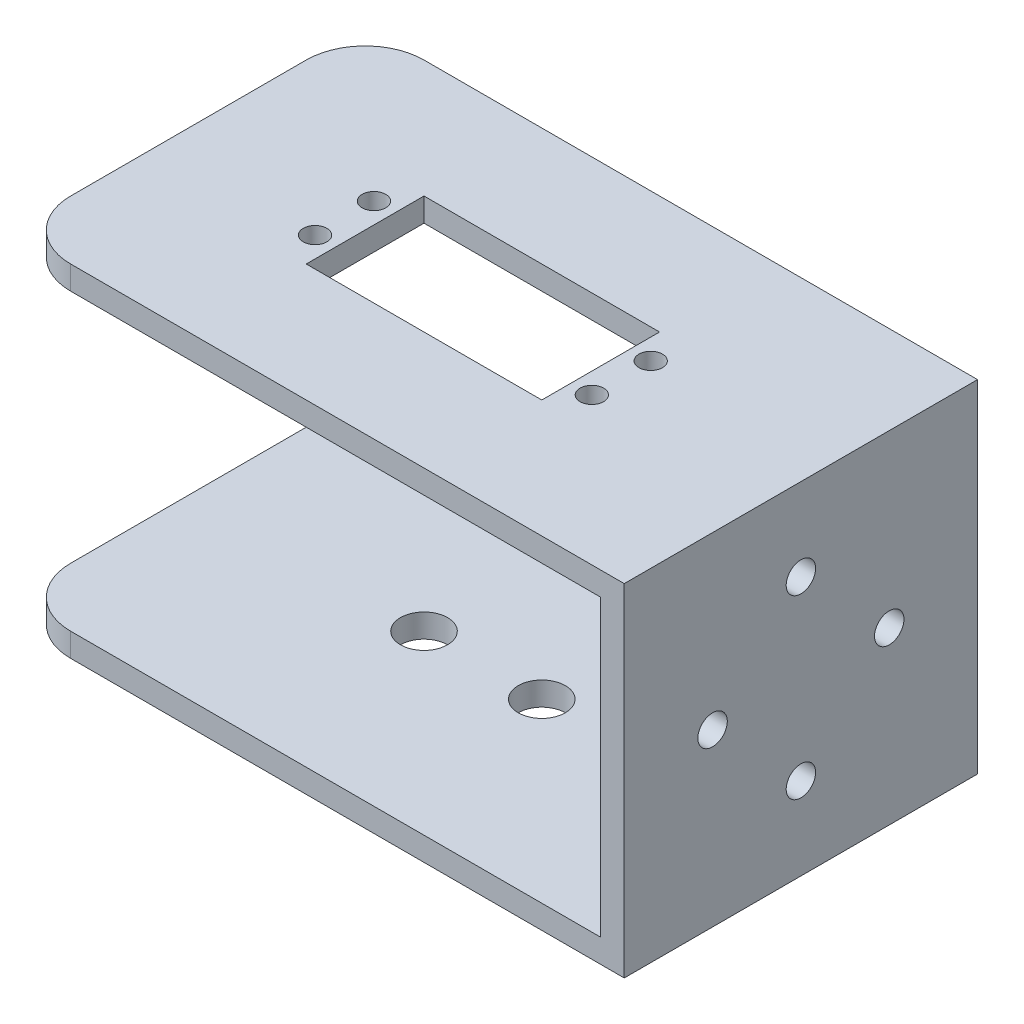
ISO-10303-21;
HEADER;
FILE_DESCRIPTION(('STEP AP214'),'2;1');
FILE_NAME('part.step','',(''),(''),'','','');
FILE_SCHEMA(('AUTOMOTIVE_DESIGN { 1 0 10303 214 1 1 1 1 }'));
ENDSEC;
DATA;
#1=APPLICATION_CONTEXT('core data for automotive mechanical design processes');
#2=APPLICATION_PROTOCOL_DEFINITION('international standard','automotive_design',2000,#1);
#3=PRODUCT_CONTEXT('',#1,'mechanical');
#4=PRODUCT('Part','Part','',(#3));
#5=PRODUCT_RELATED_PRODUCT_CATEGORY('part','',(#4));
#6=PRODUCT_DEFINITION_FORMATION('','',#4);
#7=PRODUCT_DEFINITION_CONTEXT('part definition',#1,'design');
#8=PRODUCT_DEFINITION('design','',#6,#7);
#9=PRODUCT_DEFINITION_SHAPE('','',#8);
#10=(LENGTH_UNIT() NAMED_UNIT(*) SI_UNIT(.MILLI.,.METRE.));
#11=(NAMED_UNIT(*) PLANE_ANGLE_UNIT() SI_UNIT($,.RADIAN.));
#12=(NAMED_UNIT(*) SI_UNIT($,.STERADIAN.) SOLID_ANGLE_UNIT());
#13=UNCERTAINTY_MEASURE_WITH_UNIT(LENGTH_MEASURE(1.E-05),#10,'distance_accuracy_value','');
#14=(GEOMETRIC_REPRESENTATION_CONTEXT(3) GLOBAL_UNCERTAINTY_ASSIGNED_CONTEXT((#13)) GLOBAL_UNIT_ASSIGNED_CONTEXT((#10,
#11,#12)) REPRESENTATION_CONTEXT('',''));
#15=CARTESIAN_POINT('',(0.,0.,0.));
#16=DIRECTION('',(0.,0.,1.));
#17=DIRECTION('',(1.,0.,0.));
#18=AXIS2_PLACEMENT_3D('',#15,#16,#17);
#19=CARTESIAN_POINT('',(100.,54.,60.));
#20=DIRECTION('',(0.,-1.,0.));
#21=DIRECTION('',(1.,0.,0.));
#22=AXIS2_PLACEMENT_3D('',#19,#20,#21);
#23=PLANE('',#22);
#24=CARTESIAN_POINT('',(26.5,54.,25.));
#25=DIRECTION('',(0.,1.,0.));
#26=DIRECTION('',(-1.,0.,0.));
#27=AXIS2_PLACEMENT_3D('',#24,#25,#26);
#28=CIRCLE('',#27,2.);
#29=CARTESIAN_POINT('',(24.5,54.,25.));
#30=VERTEX_POINT('',#29);
#31=EDGE_CURVE('E178',#30,#30,#28,.T.);
#32=ORIENTED_EDGE('',*,*,#31,.F.);
#33=EDGE_LOOP('',(#32));
#34=FACE_BOUND('',#33,.T.);
#35=CARTESIAN_POINT('',(26.5,54.,35.));
#36=DIRECTION('',(0.,1.,0.));
#37=DIRECTION('',(1.,0.,0.));
#38=AXIS2_PLACEMENT_3D('',#35,#36,#37);
#39=CIRCLE('',#38,1.99999999999999);
#40=CARTESIAN_POINT('',(28.5,54.,35.));
#41=VERTEX_POINT('',#40);
#42=EDGE_CURVE('E428',#41,#41,#39,.T.);
#43=ORIENTED_EDGE('',*,*,#42,.F.);
#44=EDGE_LOOP('',(#43));
#45=FACE_BOUND('',#44,.T.);
#46=CARTESIAN_POINT('',(73.5,54.,35.));
#47=DIRECTION('',(0.,1.,0.));
#48=DIRECTION('',(-1.,0.,0.));
#49=AXIS2_PLACEMENT_3D('',#46,#47,#48);
#50=CIRCLE('',#49,1.99999999999999);
#51=CARTESIAN_POINT('',(71.5,54.,35.));
#52=VERTEX_POINT('',#51);
#53=EDGE_CURVE('E434',#52,#52,#50,.T.);
#54=ORIENTED_EDGE('',*,*,#53,.F.);
#55=EDGE_LOOP('',(#54));
#56=FACE_BOUND('',#55,.T.);
#57=CARTESIAN_POINT('',(73.5,54.,25.));
#58=DIRECTION('',(0.,1.,0.));
#59=DIRECTION('',(1.,0.,0.));
#60=AXIS2_PLACEMENT_3D('',#57,#58,#59);
#61=CIRCLE('',#60,2.);
#62=CARTESIAN_POINT('',(75.5,54.,25.));
#63=VERTEX_POINT('',#62);
#64=EDGE_CURVE('E417',#63,#63,#61,.T.);
#65=ORIENTED_EDGE('',*,*,#64,.F.);
#66=EDGE_LOOP('',(#65));
#67=FACE_BOUND('',#66,.T.);
#68=DIRECTION('',(1.,0.,0.));
#69=VECTOR('',#68,1.);
#70=CARTESIAN_POINT('',(30.,54.,40.));
#71=LINE('',#70,#69);
#72=CARTESIAN_POINT('',(30.,54.,40.));
#73=VERTEX_POINT('',#72);
#74=CARTESIAN_POINT('',(70.,54.,40.));
#75=VERTEX_POINT('',#74);
#76=EDGE_CURVE('E169',#73,#75,#71,.T.);
#77=ORIENTED_EDGE('',*,*,#76,.F.);
#78=DIRECTION('',(0.,0.,1.));
#79=VECTOR('',#78,1.);
#80=CARTESIAN_POINT('',(30.,54.,20.));
#81=LINE('',#80,#79);
#82=CARTESIAN_POINT('',(30.,54.,20.));
#83=VERTEX_POINT('',#82);
#84=EDGE_CURVE('E50',#83,#73,#81,.T.);
#85=ORIENTED_EDGE('',*,*,#84,.F.);
#86=DIRECTION('',(-1.,0.,0.));
#87=VECTOR('',#86,1.);
#88=CARTESIAN_POINT('',(30.,54.,20.));
#89=LINE('',#88,#87);
#90=CARTESIAN_POINT('',(70.,54.,20.));
#91=VERTEX_POINT('',#90);
#92=EDGE_CURVE('E157',#91,#83,#89,.T.);
#93=ORIENTED_EDGE('',*,*,#92,.F.);
#94=DIRECTION('',(0.,0.,-1.));
#95=VECTOR('',#94,1.);
#96=CARTESIAN_POINT('',(70.,54.,20.));
#97=LINE('',#96,#95);
#98=EDGE_CURVE('E165',#75,#91,#97,.T.);
#99=ORIENTED_EDGE('',*,*,#98,.F.);
#100=EDGE_LOOP('',(#77,#85,#93,#99));
#101=FACE_BOUND('',#100,.T.);
#102=DIRECTION('',(-1.,0.,0.));
#103=VECTOR('',#102,1.);
#104=CARTESIAN_POINT('',(100.,54.,0.));
#105=LINE('',#104,#103);
#106=CARTESIAN_POINT('',(104.,54.,0.));
#107=VERTEX_POINT('',#106);
#108=CARTESIAN_POINT('',(9.99999999999999,54.,0.));
#109=VERTEX_POINT('',#108);
#110=EDGE_CURVE('E205',#107,#109,#105,.T.);
#111=ORIENTED_EDGE('',*,*,#110,.T.);
#112=CARTESIAN_POINT('',(10.,54.,10.));
#113=DIRECTION('',(0.,-1.,0.));
#114=DIRECTION('',(1.,0.,0.));
#115=AXIS2_PLACEMENT_3D('',#112,#113,#114);
#116=CIRCLE('',#115,10.);
#117=CARTESIAN_POINT('',(0.,54.,10.));
#118=VERTEX_POINT('',#117);
#119=EDGE_CURVE('E285',#109,#118,#116,.F.);
#120=ORIENTED_EDGE('',*,*,#119,.T.);
#121=DIRECTION('',(0.,0.,-1.));
#122=VECTOR('',#121,1.);
#123=CARTESIAN_POINT('',(0.,54.,60.));
#124=LINE('',#123,#122);
#125=CARTESIAN_POINT('',(0.,54.,50.));
#126=VERTEX_POINT('',#125);
#127=EDGE_CURVE('E257',#126,#118,#124,.T.);
#128=ORIENTED_EDGE('',*,*,#127,.F.);
#129=CARTESIAN_POINT('',(10.,54.,50.));
#130=DIRECTION('',(0.,-1.,0.));
#131=DIRECTION('',(1.,0.,0.));
#132=AXIS2_PLACEMENT_3D('',#129,#130,#131);
#133=CIRCLE('',#132,10.);
#134=CARTESIAN_POINT('',(9.99999999999999,54.,60.));
#135=VERTEX_POINT('',#134);
#136=EDGE_CURVE('E283',#126,#135,#133,.F.);
#137=ORIENTED_EDGE('',*,*,#136,.T.);
#138=DIRECTION('',(-1.,0.,0.));
#139=VECTOR('',#138,1.);
#140=CARTESIAN_POINT('',(100.,54.,60.));
#141=LINE('',#140,#139);
#142=CARTESIAN_POINT('',(104.,54.,60.));
#143=VERTEX_POINT('',#142);
#144=EDGE_CURVE('E208',#143,#135,#141,.T.);
#145=ORIENTED_EDGE('',*,*,#144,.F.);
#146=DIRECTION('',(0.,0.,-1.));
#147=VECTOR('',#146,1.);
#148=CARTESIAN_POINT('',(104.,54.,60.));
#149=LINE('',#148,#147);
#150=EDGE_CURVE('E224',#143,#107,#149,.T.);
#151=ORIENTED_EDGE('',*,*,#150,.T.);
#152=EDGE_LOOP('',(#111,#120,#128,#137,#145,#151));
#153=FACE_BOUND('',#152,.T.);
#154=ADVANCED_FACE('F35',(#34,#45,#56,#67,#101,#153),#23,.F.);
#155=CARTESIAN_POINT('',(0.,50.,60.));
#156=DIRECTION('',(-1.,0.,0.));
#157=DIRECTION('',(0.,0.,1.));
#158=AXIS2_PLACEMENT_3D('',#155,#156,#157);
#159=PLANE('',#158);
#160=ORIENTED_EDGE('',*,*,#127,.T.);
#161=DIRECTION('',(0.,1.,0.));
#162=VECTOR('',#161,1.);
#163=CARTESIAN_POINT('',(0.,50.,10.));
#164=LINE('',#163,#162);
#165=CARTESIAN_POINT('',(0.,50.,10.));
#166=VERTEX_POINT('',#165);
#167=EDGE_CURVE('E290',#118,#166,#164,.F.);
#168=ORIENTED_EDGE('',*,*,#167,.T.);
#169=DIRECTION('',(0.,0.,-1.));
#170=VECTOR('',#169,1.);
#171=CARTESIAN_POINT('',(0.,50.,60.));
#172=LINE('',#171,#170);
#173=CARTESIAN_POINT('',(0.,50.,50.));
#174=VERTEX_POINT('',#173);
#175=EDGE_CURVE('E254',#174,#166,#172,.T.);
#176=ORIENTED_EDGE('',*,*,#175,.F.);
#177=DIRECTION('',(0.,1.,0.));
#178=VECTOR('',#177,1.);
#179=CARTESIAN_POINT('',(0.,54.,50.));
#180=LINE('',#179,#178);
#181=EDGE_CURVE('E287',#174,#126,#180,.T.);
#182=ORIENTED_EDGE('',*,*,#181,.T.);
#183=EDGE_LOOP('',(#160,#168,#176,#182));
#184=FACE_BOUND('',#183,.T.);
#185=ADVANCED_FACE('F301',(#184),#159,.T.);
#186=CARTESIAN_POINT('',(100.,50.,60.));
#187=DIRECTION('',(0.,-1.,0.));
#188=DIRECTION('',(1.,0.,0.));
#189=AXIS2_PLACEMENT_3D('',#186,#187,#188);
#190=PLANE('',#189);
#191=CARTESIAN_POINT('',(26.5,50.,25.));
#192=DIRECTION('',(0.,-1.,0.));
#193=DIRECTION('',(1.,0.,0.));
#194=AXIS2_PLACEMENT_3D('',#191,#192,#193);
#195=CIRCLE('',#194,2.);
#196=CARTESIAN_POINT('',(28.5,50.,25.));
#197=VERTEX_POINT('',#196);
#198=EDGE_CURVE('E425',#197,#197,#195,.F.);
#199=ORIENTED_EDGE('',*,*,#198,.T.);
#200=EDGE_LOOP('',(#199));
#201=FACE_BOUND('',#200,.T.);
#202=CARTESIAN_POINT('',(26.5,50.,35.));
#203=DIRECTION('',(0.,-1.,0.));
#204=DIRECTION('',(1.,0.,0.));
#205=AXIS2_PLACEMENT_3D('',#202,#203,#204);
#206=CIRCLE('',#205,1.99999999999999);
#207=CARTESIAN_POINT('',(28.5,50.,35.));
#208=VERTEX_POINT('',#207);
#209=EDGE_CURVE('E431',#208,#208,#206,.F.);
#210=ORIENTED_EDGE('',*,*,#209,.T.);
#211=EDGE_LOOP('',(#210));
#212=FACE_BOUND('',#211,.T.);
#213=CARTESIAN_POINT('',(73.5,50.,35.));
#214=DIRECTION('',(0.,-1.,0.));
#215=DIRECTION('',(1.,0.,0.));
#216=AXIS2_PLACEMENT_3D('',#213,#214,#215);
#217=CIRCLE('',#216,1.99999999999999);
#218=CARTESIAN_POINT('',(75.5,50.,35.));
#219=VERTEX_POINT('',#218);
#220=EDGE_CURVE('E437',#219,#219,#217,.F.);
#221=ORIENTED_EDGE('',*,*,#220,.T.);
#222=EDGE_LOOP('',(#221));
#223=FACE_BOUND('',#222,.T.);
#224=CARTESIAN_POINT('',(73.5,50.,25.));
#225=DIRECTION('',(0.,-1.,0.));
#226=DIRECTION('',(1.,0.,0.));
#227=AXIS2_PLACEMENT_3D('',#224,#225,#226);
#228=CIRCLE('',#227,2.);
#229=CARTESIAN_POINT('',(75.5,50.,25.));
#230=VERTEX_POINT('',#229);
#231=EDGE_CURVE('E413',#230,#230,#228,.F.);
#232=ORIENTED_EDGE('',*,*,#231,.T.);
#233=EDGE_LOOP('',(#232));
#234=FACE_BOUND('',#233,.T.);
#235=DIRECTION('',(0.,0.,1.));
#236=VECTOR('',#235,1.);
#237=CARTESIAN_POINT('',(30.,50.,20.));
#238=LINE('',#237,#236);
#239=CARTESIAN_POINT('',(30.,50.,20.));
#240=VERTEX_POINT('',#239);
#241=CARTESIAN_POINT('',(30.,50.,40.));
#242=VERTEX_POINT('',#241);
#243=EDGE_CURVE('E150',#240,#242,#238,.T.);
#244=ORIENTED_EDGE('',*,*,#243,.T.);
#245=DIRECTION('',(1.,0.,0.));
#246=VECTOR('',#245,1.);
#247=CARTESIAN_POINT('',(30.,50.,40.));
#248=LINE('',#247,#246);
#249=CARTESIAN_POINT('',(70.,50.,40.));
#250=VERTEX_POINT('',#249);
#251=EDGE_CURVE('E172',#242,#250,#248,.T.);
#252=ORIENTED_EDGE('',*,*,#251,.T.);
#253=DIRECTION('',(0.,0.,-1.));
#254=VECTOR('',#253,1.);
#255=CARTESIAN_POINT('',(70.,50.,20.));
#256=LINE('',#255,#254);
#257=CARTESIAN_POINT('',(70.,50.,20.));
#258=VERTEX_POINT('',#257);
#259=EDGE_CURVE('E153',#250,#258,#256,.T.);
#260=ORIENTED_EDGE('',*,*,#259,.T.);
#261=DIRECTION('',(-1.,0.,0.));
#262=VECTOR('',#261,1.);
#263=CARTESIAN_POINT('',(30.,50.,20.));
#264=LINE('',#263,#262);
#265=EDGE_CURVE('E154',#258,#240,#264,.T.);
#266=ORIENTED_EDGE('',*,*,#265,.T.);
#267=EDGE_LOOP('',(#244,#252,#260,#266));
#268=FACE_BOUND('',#267,.T.);
#269=ORIENTED_EDGE('',*,*,#175,.T.);
#270=CARTESIAN_POINT('',(10.,50.,10.));
#271=DIRECTION('',(0.,-1.,0.));
#272=DIRECTION('',(1.,0.,0.));
#273=AXIS2_PLACEMENT_3D('',#270,#271,#272);
#274=CIRCLE('',#273,10.);
#275=CARTESIAN_POINT('',(9.99999999999999,50.,0.));
#276=VERTEX_POINT('',#275);
#277=EDGE_CURVE('E11',#166,#276,#274,.T.);
#278=ORIENTED_EDGE('',*,*,#277,.T.);
#279=DIRECTION('',(-1.,0.,0.));
#280=VECTOR('',#279,1.);
#281=CARTESIAN_POINT('',(100.,50.,0.));
#282=LINE('',#281,#280);
#283=CARTESIAN_POINT('',(100.,50.,0.));
#284=VERTEX_POINT('',#283);
#285=EDGE_CURVE('E227',#284,#276,#282,.T.);
#286=ORIENTED_EDGE('',*,*,#285,.F.);
#287=DIRECTION('',(0.,0.,-1.));
#288=VECTOR('',#287,1.);
#289=CARTESIAN_POINT('',(100.,50.,60.));
#290=LINE('',#289,#288);
#291=CARTESIAN_POINT('',(100.,50.,60.));
#292=VERTEX_POINT('',#291);
#293=EDGE_CURVE('E252',#292,#284,#290,.T.);
#294=ORIENTED_EDGE('',*,*,#293,.F.);
#295=DIRECTION('',(-1.,0.,0.));
#296=VECTOR('',#295,1.);
#297=CARTESIAN_POINT('',(100.,50.,60.));
#298=LINE('',#297,#296);
#299=CARTESIAN_POINT('',(9.99999999999999,50.,60.));
#300=VERTEX_POINT('',#299);
#301=EDGE_CURVE('E211',#292,#300,#298,.T.);
#302=ORIENTED_EDGE('',*,*,#301,.T.);
#303=CARTESIAN_POINT('',(10.,50.,50.));
#304=DIRECTION('',(0.,-1.,0.));
#305=DIRECTION('',(1.,0.,0.));
#306=AXIS2_PLACEMENT_3D('',#303,#304,#305);
#307=CIRCLE('',#306,10.);
#308=EDGE_CURVE('E43',#300,#174,#307,.T.);
#309=ORIENTED_EDGE('',*,*,#308,.T.);
#310=EDGE_LOOP('',(#269,#278,#286,#294,#302,#309));
#311=FACE_BOUND('',#310,.T.);
#312=ADVANCED_FACE('F294',(#201,#212,#223,#234,#268,#311),#190,.T.);
#313=CARTESIAN_POINT('',(100.,0.,60.));
#314=DIRECTION('',(-1.,0.,0.));
#315=DIRECTION('',(0.,0.,1.));
#316=AXIS2_PLACEMENT_3D('',#313,#314,#315);
#317=PLANE('',#316);
#318=CARTESIAN_POINT('',(100.,10.,30.));
#319=DIRECTION('',(-1.,0.,0.));
#320=DIRECTION('',(0.,0.,1.));
#321=AXIS2_PLACEMENT_3D('',#318,#319,#320);
#322=CIRCLE('',#321,2.5);
#323=CARTESIAN_POINT('',(100.,10.,32.5));
#324=VERTEX_POINT('',#323);
#325=EDGE_CURVE('E188',#324,#324,#322,.F.);
#326=ORIENTED_EDGE('',*,*,#325,.T.);
#327=EDGE_LOOP('',(#326));
#328=FACE_BOUND('',#327,.T.);
#329=CARTESIAN_POINT('',(100.,25.,15.));
#330=DIRECTION('',(-1.,0.,0.));
#331=DIRECTION('',(0.,0.,1.));
#332=AXIS2_PLACEMENT_3D('',#329,#330,#331);
#333=CIRCLE('',#332,2.5);
#334=CARTESIAN_POINT('',(100.,25.,17.5));
#335=VERTEX_POINT('',#334);
#336=EDGE_CURVE('E194',#335,#335,#333,.F.);
#337=ORIENTED_EDGE('',*,*,#336,.T.);
#338=EDGE_LOOP('',(#337));
#339=FACE_BOUND('',#338,.T.);
#340=CARTESIAN_POINT('',(100.,25.,45.));
#341=DIRECTION('',(-1.,0.,0.));
#342=DIRECTION('',(0.,0.,1.));
#343=AXIS2_PLACEMENT_3D('',#340,#341,#342);
#344=CIRCLE('',#343,2.5);
#345=CARTESIAN_POINT('',(100.,25.,47.5));
#346=VERTEX_POINT('',#345);
#347=EDGE_CURVE('E164',#346,#346,#344,.F.);
#348=ORIENTED_EDGE('',*,*,#347,.T.);
#349=EDGE_LOOP('',(#348));
#350=FACE_BOUND('',#349,.T.);
#351=CARTESIAN_POINT('',(100.,40.,30.));
#352=DIRECTION('',(-1.,0.,0.));
#353=DIRECTION('',(0.,0.,1.));
#354=AXIS2_PLACEMENT_3D('',#351,#352,#353);
#355=CIRCLE('',#354,2.5);
#356=CARTESIAN_POINT('',(100.,40.,32.5));
#357=VERTEX_POINT('',#356);
#358=EDGE_CURVE('E187',#357,#357,#355,.F.);
#359=ORIENTED_EDGE('',*,*,#358,.T.);
#360=EDGE_LOOP('',(#359));
#361=FACE_BOUND('',#360,.T.);
#362=DIRECTION('',(0.,1.,0.));
#363=VECTOR('',#362,1.);
#364=CARTESIAN_POINT('',(100.,0.,0.));
#365=LINE('',#364,#363);
#366=CARTESIAN_POINT('',(100.,0.,0.));
#367=VERTEX_POINT('',#366);
#368=EDGE_CURVE('E230',#367,#284,#365,.T.);
#369=ORIENTED_EDGE('',*,*,#368,.F.);
#370=DIRECTION('',(0.,0.,-1.));
#371=VECTOR('',#370,1.);
#372=CARTESIAN_POINT('',(100.,0.,60.));
#373=LINE('',#372,#371);
#374=CARTESIAN_POINT('',(100.,0.,60.));
#375=VERTEX_POINT('',#374);
#376=EDGE_CURVE('E249',#375,#367,#373,.T.);
#377=ORIENTED_EDGE('',*,*,#376,.F.);
#378=DIRECTION('',(0.,1.,0.));
#379=VECTOR('',#378,1.);
#380=CARTESIAN_POINT('',(100.,0.,60.));
#381=LINE('',#380,#379);
#382=EDGE_CURVE('E215',#375,#292,#381,.T.);
#383=ORIENTED_EDGE('',*,*,#382,.T.);
#384=ORIENTED_EDGE('',*,*,#293,.T.);
#385=EDGE_LOOP('',(#369,#377,#383,#384));
#386=FACE_BOUND('',#385,.T.);
#387=ADVANCED_FACE('F327',(#328,#339,#350,#361,#386),#317,.T.);
#388=CARTESIAN_POINT('',(0.,0.,60.));
#389=DIRECTION('',(0.,1.,0.));
#390=DIRECTION('',(0.,0.,1.));
#391=AXIS2_PLACEMENT_3D('',#388,#389,#390);
#392=PLANE('',#391);
#393=CARTESIAN_POINT('',(60.,0.,30.));
#394=DIRECTION('',(0.,1.,0.));
#395=DIRECTION('',(0.,0.,1.));
#396=AXIS2_PLACEMENT_3D('',#393,#394,#395);
#397=CIRCLE('',#396,4.00000000000001);
#398=CARTESIAN_POINT('',(60.,0.,26.));
#399=VERTEX_POINT('',#398);
#400=EDGE_CURVE('E422',#399,#399,#397,.F.);
#401=ORIENTED_EDGE('',*,*,#400,.T.);
#402=EDGE_LOOP('',(#401));
#403=FACE_BOUND('',#402,.T.);
#404=CARTESIAN_POINT('',(40.,0.,30.));
#405=DIRECTION('',(0.,1.,0.));
#406=DIRECTION('',(0.,0.,1.));
#407=AXIS2_PLACEMENT_3D('',#404,#405,#406);
#408=CIRCLE('',#407,4.);
#409=CARTESIAN_POINT('',(40.,0.,26.));
#410=VERTEX_POINT('',#409);
#411=EDGE_CURVE('E414',#410,#410,#408,.F.);
#412=ORIENTED_EDGE('',*,*,#411,.T.);
#413=EDGE_LOOP('',(#412));
#414=FACE_BOUND('',#413,.T.);
#415=DIRECTION('',(0.,0.,-1.));
#416=VECTOR('',#415,1.);
#417=CARTESIAN_POINT('',(0.,0.,60.));
#418=LINE('',#417,#416);
#419=CARTESIAN_POINT('',(0.,0.,50.));
#420=VERTEX_POINT('',#419);
#421=CARTESIAN_POINT('',(0.,0.,10.));
#422=VERTEX_POINT('',#421);
#423=EDGE_CURVE('E246',#420,#422,#418,.T.);
#424=ORIENTED_EDGE('',*,*,#423,.F.);
#425=CARTESIAN_POINT('',(10.,0.,50.));
#426=DIRECTION('',(0.,1.,0.));
#427=DIRECTION('',(0.,0.,1.));
#428=AXIS2_PLACEMENT_3D('',#425,#426,#427);
#429=CIRCLE('',#428,10.);
#430=CARTESIAN_POINT('',(10.,0.,60.));
#431=VERTEX_POINT('',#430);
#432=EDGE_CURVE('E267',#420,#431,#429,.T.);
#433=ORIENTED_EDGE('',*,*,#432,.T.);
#434=DIRECTION('',(1.,0.,0.));
#435=VECTOR('',#434,1.);
#436=CARTESIAN_POINT('',(0.,0.,60.));
#437=LINE('',#436,#435);
#438=EDGE_CURVE('E218',#431,#375,#437,.T.);
#439=ORIENTED_EDGE('',*,*,#438,.T.);
#440=ORIENTED_EDGE('',*,*,#376,.T.);
#441=DIRECTION('',(1.,0.,0.));
#442=VECTOR('',#441,1.);
#443=CARTESIAN_POINT('',(0.,0.,0.));
#444=LINE('',#443,#442);
#445=CARTESIAN_POINT('',(10.,0.,0.));
#446=VERTEX_POINT('',#445);
#447=EDGE_CURVE('E233',#446,#367,#444,.T.);
#448=ORIENTED_EDGE('',*,*,#447,.F.);
#449=CARTESIAN_POINT('',(10.,0.,10.));
#450=DIRECTION('',(0.,1.,0.));
#451=DIRECTION('',(0.,0.,1.));
#452=AXIS2_PLACEMENT_3D('',#449,#450,#451);
#453=CIRCLE('',#452,10.);
#454=EDGE_CURVE('E265',#446,#422,#453,.T.);
#455=ORIENTED_EDGE('',*,*,#454,.T.);
#456=EDGE_LOOP('',(#424,#433,#439,#440,#448,#455));
#457=FACE_BOUND('',#456,.T.);
#458=ADVANCED_FACE('F346',(#403,#414,#457),#392,.T.);
#459=CARTESIAN_POINT('',(0.,-4.,60.));
#460=DIRECTION('',(-1.,0.,0.));
#461=DIRECTION('',(0.,0.,1.));
#462=AXIS2_PLACEMENT_3D('',#459,#460,#461);
#463=PLANE('',#462);
#464=DIRECTION('',(0.,0.,-1.));
#465=VECTOR('',#464,1.);
#466=CARTESIAN_POINT('',(0.,-4.,60.));
#467=LINE('',#466,#465);
#468=CARTESIAN_POINT('',(0.,-4.,50.));
#469=VERTEX_POINT('',#468);
#470=CARTESIAN_POINT('',(0.,-4.,10.));
#471=VERTEX_POINT('',#470);
#472=EDGE_CURVE('E243',#469,#471,#467,.T.);
#473=ORIENTED_EDGE('',*,*,#472,.F.);
#474=DIRECTION('',(0.,1.,0.));
#475=VECTOR('',#474,1.);
#476=CARTESIAN_POINT('',(0.,0.,50.));
#477=LINE('',#476,#475);
#478=EDGE_CURVE('E262',#469,#420,#477,.T.);
#479=ORIENTED_EDGE('',*,*,#478,.T.);
#480=ORIENTED_EDGE('',*,*,#423,.T.);
#481=DIRECTION('',(0.,1.,0.));
#482=VECTOR('',#481,1.);
#483=CARTESIAN_POINT('',(0.,-4.,10.));
#484=LINE('',#483,#482);
#485=EDGE_CURVE('E260',#422,#471,#484,.F.);
#486=ORIENTED_EDGE('',*,*,#485,.T.);
#487=EDGE_LOOP('',(#473,#479,#480,#486));
#488=FACE_BOUND('',#487,.T.);
#489=ADVANCED_FACE('F340',(#488),#463,.T.);
#490=CARTESIAN_POINT('',(0.,-4.,60.));
#491=DIRECTION('',(0.,1.,0.));
#492=DIRECTION('',(0.,0.,1.));
#493=AXIS2_PLACEMENT_3D('',#490,#491,#492);
#494=PLANE('',#493);
#495=CARTESIAN_POINT('',(60.,-4.,30.));
#496=DIRECTION('',(0.,-1.,0.));
#497=DIRECTION('',(0.,0.,-1.));
#498=AXIS2_PLACEMENT_3D('',#495,#496,#497);
#499=CIRCLE('',#498,4.00000000000001);
#500=CARTESIAN_POINT('',(60.,-4.,26.));
#501=VERTEX_POINT('',#500);
#502=EDGE_CURVE('E408',#501,#501,#499,.T.);
#503=ORIENTED_EDGE('',*,*,#502,.F.);
#504=EDGE_LOOP('',(#503));
#505=FACE_BOUND('',#504,.T.);
#506=CARTESIAN_POINT('',(40.,-4.,30.));
#507=DIRECTION('',(0.,-1.,0.));
#508=DIRECTION('',(0.,0.,-1.));
#509=AXIS2_PLACEMENT_3D('',#506,#507,#508);
#510=CIRCLE('',#509,4.);
#511=CARTESIAN_POINT('',(40.,-4.,26.));
#512=VERTEX_POINT('',#511);
#513=EDGE_CURVE('E411',#512,#512,#510,.T.);
#514=ORIENTED_EDGE('',*,*,#513,.F.);
#515=EDGE_LOOP('',(#514));
#516=FACE_BOUND('',#515,.T.);
#517=DIRECTION('',(1.,0.,0.));
#518=VECTOR('',#517,1.);
#519=CARTESIAN_POINT('',(0.,-4.,60.));
#520=LINE('',#519,#518);
#521=CARTESIAN_POINT('',(10.,-4.,60.));
#522=VERTEX_POINT('',#521);
#523=CARTESIAN_POINT('',(104.,-4.,60.));
#524=VERTEX_POINT('',#523);
#525=EDGE_CURVE('E220',#522,#524,#520,.T.);
#526=ORIENTED_EDGE('',*,*,#525,.F.);
#527=CARTESIAN_POINT('',(10.,-4.,50.));
#528=DIRECTION('',(0.,1.,0.));
#529=DIRECTION('',(0.,0.,1.));
#530=AXIS2_PLACEMENT_3D('',#527,#528,#529);
#531=CIRCLE('',#530,10.);
#532=EDGE_CURVE('E275',#522,#469,#531,.F.);
#533=ORIENTED_EDGE('',*,*,#532,.T.);
#534=ORIENTED_EDGE('',*,*,#472,.T.);
#535=CARTESIAN_POINT('',(10.,-4.,10.));
#536=DIRECTION('',(0.,1.,0.));
#537=DIRECTION('',(0.,0.,1.));
#538=AXIS2_PLACEMENT_3D('',#535,#536,#537);
#539=CIRCLE('',#538,10.);
#540=CARTESIAN_POINT('',(10.,-4.,0.));
#541=VERTEX_POINT('',#540);
#542=EDGE_CURVE('E273',#471,#541,#539,.F.);
#543=ORIENTED_EDGE('',*,*,#542,.T.);
#544=DIRECTION('',(1.,0.,0.));
#545=VECTOR('',#544,1.);
#546=CARTESIAN_POINT('',(0.,-4.,0.));
#547=LINE('',#546,#545);
#548=CARTESIAN_POINT('',(104.,-4.,0.));
#549=VERTEX_POINT('',#548);
#550=EDGE_CURVE('E235',#541,#549,#547,.T.);
#551=ORIENTED_EDGE('',*,*,#550,.T.);
#552=DIRECTION('',(0.,0.,-1.));
#553=VECTOR('',#552,1.);
#554=CARTESIAN_POINT('',(104.,-4.,60.));
#555=LINE('',#554,#553);
#556=EDGE_CURVE('E240',#524,#549,#555,.T.);
#557=ORIENTED_EDGE('',*,*,#556,.F.);
#558=EDGE_LOOP('',(#526,#533,#534,#543,#551,#557));
#559=FACE_BOUND('',#558,.T.);
#560=ADVANCED_FACE('F337',(#505,#516,#559),#494,.F.);
#561=CARTESIAN_POINT('',(104.,0.,60.));
#562=DIRECTION('',(-1.,0.,0.));
#563=DIRECTION('',(0.,0.,1.));
#564=AXIS2_PLACEMENT_3D('',#561,#562,#563);
#565=PLANE('',#564);
#566=CARTESIAN_POINT('',(104.,10.,30.));
#567=DIRECTION('',(1.,0.,0.));
#568=DIRECTION('',(0.,0.,1.));
#569=AXIS2_PLACEMENT_3D('',#566,#567,#568);
#570=CIRCLE('',#569,2.5);
#571=CARTESIAN_POINT('',(104.,10.,32.5));
#572=VERTEX_POINT('',#571);
#573=EDGE_CURVE('E184',#572,#572,#570,.T.);
#574=ORIENTED_EDGE('',*,*,#573,.F.);
#575=EDGE_LOOP('',(#574));
#576=FACE_BOUND('',#575,.T.);
#577=CARTESIAN_POINT('',(104.,25.,15.));
#578=DIRECTION('',(1.,0.,0.));
#579=DIRECTION('',(0.,0.,-1.));
#580=AXIS2_PLACEMENT_3D('',#577,#578,#579);
#581=CIRCLE('',#580,2.5);
#582=CARTESIAN_POINT('',(104.,25.,12.5));
#583=VERTEX_POINT('',#582);
#584=EDGE_CURVE('E191',#583,#583,#581,.T.);
#585=ORIENTED_EDGE('',*,*,#584,.F.);
#586=EDGE_LOOP('',(#585));
#587=FACE_BOUND('',#586,.T.);
#588=CARTESIAN_POINT('',(104.,25.,45.));
#589=DIRECTION('',(1.,0.,0.));
#590=DIRECTION('',(0.,0.,1.));
#591=AXIS2_PLACEMENT_3D('',#588,#589,#590);
#592=CIRCLE('',#591,2.5);
#593=CARTESIAN_POINT('',(104.,25.,47.5));
#594=VERTEX_POINT('',#593);
#595=EDGE_CURVE('E197',#594,#594,#592,.T.);
#596=ORIENTED_EDGE('',*,*,#595,.F.);
#597=EDGE_LOOP('',(#596));
#598=FACE_BOUND('',#597,.T.);
#599=CARTESIAN_POINT('',(104.,40.,30.));
#600=DIRECTION('',(1.,0.,0.));
#601=DIRECTION('',(0.,0.,-1.));
#602=AXIS2_PLACEMENT_3D('',#599,#600,#601);
#603=CIRCLE('',#602,2.5);
#604=CARTESIAN_POINT('',(104.,40.,27.5));
#605=VERTEX_POINT('',#604);
#606=EDGE_CURVE('E202',#605,#605,#603,.T.);
#607=ORIENTED_EDGE('',*,*,#606,.F.);
#608=EDGE_LOOP('',(#607));
#609=FACE_BOUND('',#608,.T.);
#610=DIRECTION('',(0.,1.,0.));
#611=VECTOR('',#610,1.);
#612=CARTESIAN_POINT('',(104.,0.,0.));
#613=LINE('',#612,#611);
#614=EDGE_CURVE('E212',#549,#107,#613,.T.);
#615=ORIENTED_EDGE('',*,*,#614,.T.);
#616=ORIENTED_EDGE('',*,*,#150,.F.);
#617=DIRECTION('',(0.,1.,0.));
#618=VECTOR('',#617,1.);
#619=CARTESIAN_POINT('',(104.,0.,60.));
#620=LINE('',#619,#618);
#621=EDGE_CURVE('E222',#524,#143,#620,.T.);
#622=ORIENTED_EDGE('',*,*,#621,.F.);
#623=ORIENTED_EDGE('',*,*,#556,.T.);
#624=EDGE_LOOP('',(#615,#616,#622,#623));
#625=FACE_BOUND('',#624,.T.);
#626=ADVANCED_FACE('F313',(#576,#587,#598,#609,#625),#565,.F.);
#627=CARTESIAN_POINT('',(0.,0.,60.));
#628=DIRECTION('',(0.,0.,-1.));
#629=DIRECTION('',(-1.,0.,0.));
#630=AXIS2_PLACEMENT_3D('',#627,#628,#629);
#631=PLANE('',#630);
#632=ORIENTED_EDGE('',*,*,#438,.F.);
#633=DIRECTION('',(0.,1.,0.));
#634=VECTOR('',#633,1.);
#635=CARTESIAN_POINT('',(10.,-4.,60.));
#636=LINE('',#635,#634);
#637=EDGE_CURVE('E271',#431,#522,#636,.F.);
#638=ORIENTED_EDGE('',*,*,#637,.T.);
#639=ORIENTED_EDGE('',*,*,#525,.T.);
#640=ORIENTED_EDGE('',*,*,#621,.T.);
#641=ORIENTED_EDGE('',*,*,#144,.T.);
#642=DIRECTION('',(0.,1.,0.));
#643=VECTOR('',#642,1.);
#644=CARTESIAN_POINT('',(10.,50.,60.));
#645=LINE('',#644,#643);
#646=EDGE_CURVE('E269',#135,#300,#645,.F.);
#647=ORIENTED_EDGE('',*,*,#646,.T.);
#648=ORIENTED_EDGE('',*,*,#301,.F.);
#649=ORIENTED_EDGE('',*,*,#382,.F.);
#650=EDGE_LOOP('',(#632,#638,#639,#640,#641,#647,#648,#649));
#651=FACE_BOUND('',#650,.T.);
#652=ADVANCED_FACE('F307',(#651),#631,.F.);
#653=CARTESIAN_POINT('',(0.,0.,0.));
#654=DIRECTION('',(0.,0.,-1.));
#655=DIRECTION('',(-1.,0.,0.));
#656=AXIS2_PLACEMENT_3D('',#653,#654,#655);
#657=PLANE('',#656);
#658=ORIENTED_EDGE('',*,*,#550,.F.);
#659=DIRECTION('',(0.,1.,0.));
#660=VECTOR('',#659,1.);
#661=CARTESIAN_POINT('',(10.,0.,0.));
#662=LINE('',#661,#660);
#663=EDGE_CURVE('E280',#541,#446,#662,.T.);
#664=ORIENTED_EDGE('',*,*,#663,.T.);
#665=ORIENTED_EDGE('',*,*,#447,.T.);
#666=ORIENTED_EDGE('',*,*,#368,.T.);
#667=ORIENTED_EDGE('',*,*,#285,.T.);
#668=DIRECTION('',(0.,1.,0.));
#669=VECTOR('',#668,1.);
#670=CARTESIAN_POINT('',(10.,0.,0.));
#671=LINE('',#670,#669);
#672=EDGE_CURVE('E277',#276,#109,#671,.T.);
#673=ORIENTED_EDGE('',*,*,#672,.T.);
#674=ORIENTED_EDGE('',*,*,#110,.F.);
#675=ORIENTED_EDGE('',*,*,#614,.F.);
#676=EDGE_LOOP('',(#658,#664,#665,#666,#667,#673,#674,#675));
#677=FACE_BOUND('',#676,.T.);
#678=ADVANCED_FACE('F318',(#677),#657,.T.);
#679=CARTESIAN_POINT('',(10.,-4.,50.));
#680=DIRECTION('',(0.,-1.,0.));
#681=DIRECTION('',(0.,0.,-1.));
#682=AXIS2_PLACEMENT_3D('',#679,#680,#681);
#683=CYLINDRICAL_SURFACE('',#682,10.);
#684=ORIENTED_EDGE('',*,*,#532,.F.);
#685=ORIENTED_EDGE('',*,*,#637,.F.);
#686=ORIENTED_EDGE('',*,*,#432,.F.);
#687=ORIENTED_EDGE('',*,*,#478,.F.);
#688=EDGE_LOOP('',(#684,#685,#686,#687));
#689=FACE_BOUND('',#688,.T.);
#690=ADVANCED_FACE('F333',(#689),#683,.T.);
#691=CARTESIAN_POINT('',(10.,0.,10.));
#692=DIRECTION('',(0.,1.,0.));
#693=DIRECTION('',(0.,0.,1.));
#694=AXIS2_PLACEMENT_3D('',#691,#692,#693);
#695=CYLINDRICAL_SURFACE('',#694,10.);
#696=ORIENTED_EDGE('',*,*,#542,.F.);
#697=ORIENTED_EDGE('',*,*,#485,.F.);
#698=ORIENTED_EDGE('',*,*,#454,.F.);
#699=ORIENTED_EDGE('',*,*,#663,.F.);
#700=EDGE_LOOP('',(#696,#697,#698,#699));
#701=FACE_BOUND('',#700,.T.);
#702=ADVANCED_FACE('F344',(#701),#695,.T.);
#703=CARTESIAN_POINT('',(10.,0.,10.));
#704=DIRECTION('',(0.,1.,0.));
#705=DIRECTION('',(0.,0.,1.));
#706=AXIS2_PLACEMENT_3D('',#703,#704,#705);
#707=CYLINDRICAL_SURFACE('',#706,10.);
#708=ORIENTED_EDGE('',*,*,#277,.F.);
#709=ORIENTED_EDGE('',*,*,#167,.F.);
#710=ORIENTED_EDGE('',*,*,#119,.F.);
#711=ORIENTED_EDGE('',*,*,#672,.F.);
#712=EDGE_LOOP('',(#708,#709,#710,#711));
#713=FACE_BOUND('',#712,.T.);
#714=ADVANCED_FACE('F322',(#713),#707,.T.);
#715=CARTESIAN_POINT('',(10.,50.,50.));
#716=DIRECTION('',(0.,-1.,0.));
#717=DIRECTION('',(0.,0.,-1.));
#718=AXIS2_PLACEMENT_3D('',#715,#716,#717);
#719=CYLINDRICAL_SURFACE('',#718,10.);
#720=ORIENTED_EDGE('',*,*,#308,.F.);
#721=ORIENTED_EDGE('',*,*,#646,.F.);
#722=ORIENTED_EDGE('',*,*,#136,.F.);
#723=ORIENTED_EDGE('',*,*,#181,.F.);
#724=EDGE_LOOP('',(#720,#721,#722,#723));
#725=FACE_BOUND('',#724,.T.);
#726=ADVANCED_FACE('F37',(#725),#719,.T.);
#727=CARTESIAN_POINT('',(-0.001000000000001,40.,30.));
#728=DIRECTION('',(1.,0.,0.));
#729=DIRECTION('',(0.,0.,-1.));
#730=AXIS2_PLACEMENT_3D('',#727,#728,#729);
#731=CYLINDRICAL_SURFACE('',#730,2.5);
#732=ORIENTED_EDGE('',*,*,#358,.F.);
#733=EDGE_LOOP('',(#732));
#734=FACE_BOUND('',#733,.T.);
#735=ORIENTED_EDGE('',*,*,#606,.T.);
#736=EDGE_LOOP('',(#735));
#737=FACE_BOUND('',#736,.T.);
#738=ADVANCED_FACE('F377',(#734,#737),#731,.F.);
#739=CARTESIAN_POINT('',(-0.001000000000001,25.,45.));
#740=DIRECTION('',(1.,0.,0.));
#741=DIRECTION('',(0.,0.,-1.));
#742=AXIS2_PLACEMENT_3D('',#739,#740,#741);
#743=CYLINDRICAL_SURFACE('',#742,2.5);
#744=ORIENTED_EDGE('',*,*,#347,.F.);
#745=EDGE_LOOP('',(#744));
#746=FACE_BOUND('',#745,.T.);
#747=ORIENTED_EDGE('',*,*,#595,.T.);
#748=EDGE_LOOP('',(#747));
#749=FACE_BOUND('',#748,.T.);
#750=ADVANCED_FACE('F381',(#746,#749),#743,.F.);
#751=CARTESIAN_POINT('',(-0.001000000000001,25.,15.));
#752=DIRECTION('',(1.,0.,0.));
#753=DIRECTION('',(0.,0.,-1.));
#754=AXIS2_PLACEMENT_3D('',#751,#752,#753);
#755=CYLINDRICAL_SURFACE('',#754,2.5);
#756=ORIENTED_EDGE('',*,*,#336,.F.);
#757=EDGE_LOOP('',(#756));
#758=FACE_BOUND('',#757,.T.);
#759=ORIENTED_EDGE('',*,*,#584,.T.);
#760=EDGE_LOOP('',(#759));
#761=FACE_BOUND('',#760,.T.);
#762=ADVANCED_FACE('F387',(#758,#761),#755,.F.);
#763=CARTESIAN_POINT('',(-0.001000000000001,10.,30.));
#764=DIRECTION('',(1.,0.,0.));
#765=DIRECTION('',(0.,0.,-1.));
#766=AXIS2_PLACEMENT_3D('',#763,#764,#765);
#767=CYLINDRICAL_SURFACE('',#766,2.5);
#768=ORIENTED_EDGE('',*,*,#325,.F.);
#769=EDGE_LOOP('',(#768));
#770=FACE_BOUND('',#769,.T.);
#771=ORIENTED_EDGE('',*,*,#573,.T.);
#772=EDGE_LOOP('',(#771));
#773=FACE_BOUND('',#772,.T.);
#774=ADVANCED_FACE('F484',(#770,#773),#767,.F.);
#775=CARTESIAN_POINT('',(30.,-4.001,20.));
#776=DIRECTION('',(-1.,0.,0.));
#777=DIRECTION('',(0.,-1.,0.));
#778=AXIS2_PLACEMENT_3D('',#775,#776,#777);
#779=PLANE('',#778);
#780=DIRECTION('',(0.,1.,0.));
#781=VECTOR('',#780,1.);
#782=CARTESIAN_POINT('',(30.,-4.001,20.));
#783=LINE('',#782,#781);
#784=EDGE_CURVE('E146',#240,#83,#783,.T.);
#785=ORIENTED_EDGE('',*,*,#784,.T.);
#786=ORIENTED_EDGE('',*,*,#84,.T.);
#787=DIRECTION('',(0.,1.,0.));
#788=VECTOR('',#787,1.);
#789=CARTESIAN_POINT('',(30.,-4.001,40.));
#790=LINE('',#789,#788);
#791=EDGE_CURVE('E177',#242,#73,#790,.T.);
#792=ORIENTED_EDGE('',*,*,#791,.F.);
#793=ORIENTED_EDGE('',*,*,#243,.F.);
#794=EDGE_LOOP('',(#785,#786,#792,#793));
#795=FACE_BOUND('',#794,.T.);
#796=ADVANCED_FACE('F148',(#795),#779,.F.);
#797=CARTESIAN_POINT('',(30.,-4.001,20.));
#798=DIRECTION('',(0.,0.,-1.));
#799=DIRECTION('',(-1.,0.,0.));
#800=AXIS2_PLACEMENT_3D('',#797,#798,#799);
#801=PLANE('',#800);
#802=DIRECTION('',(0.,1.,0.));
#803=VECTOR('',#802,1.);
#804=CARTESIAN_POINT('',(70.,-4.001,20.));
#805=LINE('',#804,#803);
#806=EDGE_CURVE('E160',#258,#91,#805,.T.);
#807=ORIENTED_EDGE('',*,*,#806,.T.);
#808=ORIENTED_EDGE('',*,*,#92,.T.);
#809=ORIENTED_EDGE('',*,*,#784,.F.);
#810=ORIENTED_EDGE('',*,*,#265,.F.);
#811=EDGE_LOOP('',(#807,#808,#809,#810));
#812=FACE_BOUND('',#811,.T.);
#813=ADVANCED_FACE('F158',(#812),#801,.F.);
#814=CARTESIAN_POINT('',(70.,-4.001,20.));
#815=DIRECTION('',(1.,0.,0.));
#816=DIRECTION('',(0.,0.,-1.));
#817=AXIS2_PLACEMENT_3D('',#814,#815,#816);
#818=PLANE('',#817);
#819=DIRECTION('',(0.,1.,0.));
#820=VECTOR('',#819,1.);
#821=CARTESIAN_POINT('',(70.,-4.001,40.));
#822=LINE('',#821,#820);
#823=EDGE_CURVE('E58',#250,#75,#822,.T.);
#824=ORIENTED_EDGE('',*,*,#823,.T.);
#825=ORIENTED_EDGE('',*,*,#98,.T.);
#826=ORIENTED_EDGE('',*,*,#806,.F.);
#827=ORIENTED_EDGE('',*,*,#259,.F.);
#828=EDGE_LOOP('',(#824,#825,#826,#827));
#829=FACE_BOUND('',#828,.T.);
#830=ADVANCED_FACE('F446',(#829),#818,.F.);
#831=CARTESIAN_POINT('',(30.,-4.001,40.));
#832=DIRECTION('',(0.,0.,1.));
#833=DIRECTION('',(1.,0.,0.));
#834=AXIS2_PLACEMENT_3D('',#831,#832,#833);
#835=PLANE('',#834);
#836=ORIENTED_EDGE('',*,*,#791,.T.);
#837=ORIENTED_EDGE('',*,*,#76,.T.);
#838=ORIENTED_EDGE('',*,*,#823,.F.);
#839=ORIENTED_EDGE('',*,*,#251,.F.);
#840=EDGE_LOOP('',(#836,#837,#838,#839));
#841=FACE_BOUND('',#840,.T.);
#842=ADVANCED_FACE('F447',(#841),#835,.F.);
#843=CARTESIAN_POINT('',(73.5,-4.001,25.));
#844=DIRECTION('',(0.,1.,0.));
#845=DIRECTION('',(-1.,0.,0.));
#846=AXIS2_PLACEMENT_3D('',#843,#844,#845);
#847=CYLINDRICAL_SURFACE('',#846,2.);
#848=ORIENTED_EDGE('',*,*,#231,.F.);
#849=EDGE_LOOP('',(#848));
#850=FACE_BOUND('',#849,.T.);
#851=ORIENTED_EDGE('',*,*,#64,.T.);
#852=EDGE_LOOP('',(#851));
#853=FACE_BOUND('',#852,.T.);
#854=ADVANCED_FACE('F461',(#850,#853),#847,.F.);
#855=CARTESIAN_POINT('',(73.5,-4.001,35.));
#856=DIRECTION('',(0.,1.,0.));
#857=DIRECTION('',(-1.,0.,0.));
#858=AXIS2_PLACEMENT_3D('',#855,#856,#857);
#859=CYLINDRICAL_SURFACE('',#858,1.99999999999999);
#860=ORIENTED_EDGE('',*,*,#220,.F.);
#861=EDGE_LOOP('',(#860));
#862=FACE_BOUND('',#861,.T.);
#863=ORIENTED_EDGE('',*,*,#53,.T.);
#864=EDGE_LOOP('',(#863));
#865=FACE_BOUND('',#864,.T.);
#866=ADVANCED_FACE('F464',(#862,#865),#859,.F.);
#867=CARTESIAN_POINT('',(26.5,-4.001,35.));
#868=DIRECTION('',(0.,1.,0.));
#869=DIRECTION('',(-1.,0.,0.));
#870=AXIS2_PLACEMENT_3D('',#867,#868,#869);
#871=CYLINDRICAL_SURFACE('',#870,1.99999999999999);
#872=ORIENTED_EDGE('',*,*,#209,.F.);
#873=EDGE_LOOP('',(#872));
#874=FACE_BOUND('',#873,.T.);
#875=ORIENTED_EDGE('',*,*,#42,.T.);
#876=EDGE_LOOP('',(#875));
#877=FACE_BOUND('',#876,.T.);
#878=ADVANCED_FACE('F472',(#874,#877),#871,.F.);
#879=CARTESIAN_POINT('',(26.5,-4.001,25.));
#880=DIRECTION('',(0.,1.,0.));
#881=DIRECTION('',(-1.,0.,0.));
#882=AXIS2_PLACEMENT_3D('',#879,#880,#881);
#883=CYLINDRICAL_SURFACE('',#882,2.);
#884=ORIENTED_EDGE('',*,*,#198,.F.);
#885=EDGE_LOOP('',(#884));
#886=FACE_BOUND('',#885,.T.);
#887=ORIENTED_EDGE('',*,*,#31,.T.);
#888=EDGE_LOOP('',(#887));
#889=FACE_BOUND('',#888,.T.);
#890=ADVANCED_FACE('F545',(#886,#889),#883,.F.);
#891=CARTESIAN_POINT('',(40.,54.001,30.));
#892=DIRECTION('',(0.,-1.,0.));
#893=DIRECTION('',(0.,0.,-1.));
#894=AXIS2_PLACEMENT_3D('',#891,#892,#893);
#895=CYLINDRICAL_SURFACE('',#894,4.);
#896=CARTESIAN_POINT('',(40.,0.,26.));
#897=CARTESIAN_POINT('',(40.,-0.0416666666666736,26.));
#898=CARTESIAN_POINT('',(40.,-0.0833333333333403,26.));
#899=CARTESIAN_POINT('',(40.,-0.166666666666674,26.));
#900=CARTESIAN_POINT('',(40.,-0.20833333333334,26.));
#901=CARTESIAN_POINT('',(40.,-0.291666666666674,26.));
#902=CARTESIAN_POINT('',(40.,-0.333333333333341,26.));
#903=CARTESIAN_POINT('',(40.,-0.416666666666674,26.));
#904=CARTESIAN_POINT('',(40.,-0.458333333333341,26.));
#905=CARTESIAN_POINT('',(40.,-0.541666666666674,26.));
#906=CARTESIAN_POINT('',(40.,-0.583333333333341,26.));
#907=CARTESIAN_POINT('',(40.,-0.666666666666674,26.));
#908=CARTESIAN_POINT('',(40.,-0.708333333333341,26.));
#909=CARTESIAN_POINT('',(40.,-0.791666666666674,26.));
#910=CARTESIAN_POINT('',(40.,-0.833333333333341,26.));
#911=CARTESIAN_POINT('',(40.,-0.916666666666674,26.));
#912=CARTESIAN_POINT('',(40.,-0.958333333333341,26.));
#913=CARTESIAN_POINT('',(40.,-1.04166666666667,26.));
#914=CARTESIAN_POINT('',(40.,-1.08333333333334,26.));
#915=CARTESIAN_POINT('',(40.,-1.16666666666667,26.));
#916=CARTESIAN_POINT('',(40.,-1.20833333333333,26.));
#917=CARTESIAN_POINT('',(40.,-1.29166666666667,26.));
#918=CARTESIAN_POINT('',(40.,-1.33333333333333,26.));
#919=CARTESIAN_POINT('',(40.,-1.41666666666667,26.));
#920=CARTESIAN_POINT('',(40.,-1.45833333333333,26.));
#921=CARTESIAN_POINT('',(40.,-1.54166666666667,26.));
#922=CARTESIAN_POINT('',(40.,-1.58333333333333,26.));
#923=CARTESIAN_POINT('',(40.,-1.66666666666667,26.));
#924=CARTESIAN_POINT('',(40.,-1.70833333333333,26.));
#925=CARTESIAN_POINT('',(40.,-1.79166666666667,26.));
#926=CARTESIAN_POINT('',(40.,-1.83333333333334,26.));
#927=CARTESIAN_POINT('',(40.,-1.91666666666667,26.));
#928=CARTESIAN_POINT('',(40.,-1.95833333333334,26.));
#929=CARTESIAN_POINT('',(40.,-2.04166666666667,26.));
#930=CARTESIAN_POINT('',(40.,-2.08333333333334,26.));
#931=CARTESIAN_POINT('',(40.,-2.16666666666667,26.));
#932=CARTESIAN_POINT('',(40.,-2.20833333333334,26.));
#933=CARTESIAN_POINT('',(40.,-2.29166666666667,26.));
#934=CARTESIAN_POINT('',(40.,-2.33333333333334,26.));
#935=CARTESIAN_POINT('',(40.,-2.41666666666667,26.));
#936=CARTESIAN_POINT('',(40.,-2.45833333333334,26.));
#937=CARTESIAN_POINT('',(40.,-2.54166666666667,26.));
#938=CARTESIAN_POINT('',(40.,-2.58333333333334,26.));
#939=CARTESIAN_POINT('',(40.,-2.66666666666667,26.));
#940=CARTESIAN_POINT('',(40.,-2.70833333333334,26.));
#941=CARTESIAN_POINT('',(40.,-2.79166666666667,26.));
#942=CARTESIAN_POINT('',(40.,-2.83333333333334,26.));
#943=CARTESIAN_POINT('',(40.,-2.91666666666667,26.));
#944=CARTESIAN_POINT('',(40.,-2.95833333333333,26.));
#945=CARTESIAN_POINT('',(40.,-3.04166666666666,26.));
#946=CARTESIAN_POINT('',(40.,-3.08333333333333,26.));
#947=CARTESIAN_POINT('',(40.,-3.16666666666666,26.));
#948=CARTESIAN_POINT('',(40.,-3.20833333333333,26.));
#949=CARTESIAN_POINT('',(40.,-3.29166666666666,26.));
#950=CARTESIAN_POINT('',(40.,-3.33333333333333,26.));
#951=CARTESIAN_POINT('',(40.,-3.41666666666666,26.));
#952=CARTESIAN_POINT('',(40.,-3.45833333333333,26.));
#953=CARTESIAN_POINT('',(40.,-3.54166666666666,26.));
#954=CARTESIAN_POINT('',(40.,-3.58333333333333,26.));
#955=CARTESIAN_POINT('',(40.,-3.66666666666666,26.));
#956=CARTESIAN_POINT('',(40.,-3.70833333333333,26.));
#957=CARTESIAN_POINT('',(40.,-3.79166666666666,26.));
#958=CARTESIAN_POINT('',(40.,-3.83333333333333,26.));
#959=CARTESIAN_POINT('',(40.,-3.91666666666666,26.));
#960=CARTESIAN_POINT('',(40.,-3.95833333333333,26.));
#961=CARTESIAN_POINT('',(40.,-4.,26.));
#962=B_SPLINE_CURVE_WITH_KNOTS('',3,(#896,#897,#898,#899,#900,#901,#902,#903,#904,#905,#906,
#907,#908,#909,#910,#911,#912,#913,#914,#915,#916,#917,#918,#919,#920,#921,#922,#923,#924,#925,
#926,#927,#928,#929,#930,#931,#932,#933,#934,#935,#936,#937,#938,#939,#940,#941,#942,#943,#944,
#945,#946,#947,#948,#949,#950,#951,#952,#953,#954,#955,#956,#957,#958,#959,#960,#961),
.UNSPECIFIED.,.F.,.F.,(4,2,2,2,2,2,2,2,2,2,2,2,2,2,2,2,2,2,2,2,2,2,2,2,2,2,2,2,2,2,2,2,4),(0.,
0.125,0.25,0.375,0.5,0.625000000000001,0.750000000000001,0.875000000000001,1.,1.12499999999999,
1.24999999999999,1.37499999999999,1.49999999999999,1.62499999999999,1.74999999999999,
1.87499999999999,1.99999999999999,2.125,2.25,2.375,2.5,2.625,2.75,2.875,2.99999999999999,
3.12499999999999,3.24999999999999,3.37499999999999,3.49999999999999,3.62499999999999,
3.74999999999999,3.87499999999999,3.99999999999999),.UNSPECIFIED.);
#963=EDGE_CURVE('BSEAM553',#410,#512,#962,.T.);
#964=ORIENTED_EDGE('',*,*,#411,.F.);
#965=ORIENTED_EDGE('',*,*,#513,.T.);
#966=ORIENTED_EDGE('',*,*,#963,.T.);
#967=ORIENTED_EDGE('',*,*,#963,.F.);
#968=EDGE_LOOP('',(#964,#966,#965,#967));
#969=FACE_BOUND('',#968,.T.);
#970=ADVANCED_FACE('F553',(#969),#895,.F.);
#971=CARTESIAN_POINT('',(60.,54.001,30.));
#972=DIRECTION('',(0.,-1.,0.));
#973=DIRECTION('',(0.,0.,-1.));
#974=AXIS2_PLACEMENT_3D('',#971,#972,#973);
#975=CYLINDRICAL_SURFACE('',#974,4.00000000000001);
#976=CARTESIAN_POINT('',(60.,0.,26.));
#977=CARTESIAN_POINT('',(60.,-0.0416666666666736,26.));
#978=CARTESIAN_POINT('',(60.,-0.0833333333333403,26.));
#979=CARTESIAN_POINT('',(60.,-0.166666666666674,26.));
#980=CARTESIAN_POINT('',(60.,-0.20833333333334,26.));
#981=CARTESIAN_POINT('',(60.,-0.291666666666674,26.));
#982=CARTESIAN_POINT('',(60.,-0.333333333333341,26.));
#983=CARTESIAN_POINT('',(60.,-0.416666666666674,26.));
#984=CARTESIAN_POINT('',(60.,-0.458333333333341,26.));
#985=CARTESIAN_POINT('',(60.,-0.541666666666674,26.));
#986=CARTESIAN_POINT('',(60.,-0.583333333333341,26.));
#987=CARTESIAN_POINT('',(60.,-0.666666666666674,26.));
#988=CARTESIAN_POINT('',(60.,-0.708333333333341,26.));
#989=CARTESIAN_POINT('',(60.,-0.791666666666674,26.));
#990=CARTESIAN_POINT('',(60.,-0.833333333333341,26.));
#991=CARTESIAN_POINT('',(60.,-0.916666666666674,26.));
#992=CARTESIAN_POINT('',(60.,-0.958333333333341,26.));
#993=CARTESIAN_POINT('',(60.,-1.04166666666667,26.));
#994=CARTESIAN_POINT('',(60.,-1.08333333333334,26.));
#995=CARTESIAN_POINT('',(60.,-1.16666666666667,26.));
#996=CARTESIAN_POINT('',(60.,-1.20833333333333,26.));
#997=CARTESIAN_POINT('',(60.,-1.29166666666667,26.));
#998=CARTESIAN_POINT('',(60.,-1.33333333333333,26.));
#999=CARTESIAN_POINT('',(60.,-1.41666666666667,26.));
#1000=CARTESIAN_POINT('',(60.,-1.45833333333333,26.));
#1001=CARTESIAN_POINT('',(60.,-1.54166666666667,26.));
#1002=CARTESIAN_POINT('',(60.,-1.58333333333333,26.));
#1003=CARTESIAN_POINT('',(60.,-1.66666666666667,26.));
#1004=CARTESIAN_POINT('',(60.,-1.70833333333333,26.));
#1005=CARTESIAN_POINT('',(60.,-1.79166666666667,26.));
#1006=CARTESIAN_POINT('',(60.,-1.83333333333334,26.));
#1007=CARTESIAN_POINT('',(60.,-1.91666666666667,26.));
#1008=CARTESIAN_POINT('',(60.,-1.95833333333334,26.));
#1009=CARTESIAN_POINT('',(60.,-2.04166666666667,26.));
#1010=CARTESIAN_POINT('',(60.,-2.08333333333334,26.));
#1011=CARTESIAN_POINT('',(60.,-2.16666666666667,26.));
#1012=CARTESIAN_POINT('',(60.,-2.20833333333334,26.));
#1013=CARTESIAN_POINT('',(60.,-2.29166666666667,26.));
#1014=CARTESIAN_POINT('',(60.,-2.33333333333334,26.));
#1015=CARTESIAN_POINT('',(60.,-2.41666666666667,26.));
#1016=CARTESIAN_POINT('',(60.,-2.45833333333334,26.));
#1017=CARTESIAN_POINT('',(60.,-2.54166666666667,26.));
#1018=CARTESIAN_POINT('',(60.,-2.58333333333334,26.));
#1019=CARTESIAN_POINT('',(60.,-2.66666666666667,26.));
#1020=CARTESIAN_POINT('',(60.,-2.70833333333334,26.));
#1021=CARTESIAN_POINT('',(60.,-2.79166666666667,26.));
#1022=CARTESIAN_POINT('',(60.,-2.83333333333334,26.));
#1023=CARTESIAN_POINT('',(60.,-2.91666666666667,26.));
#1024=CARTESIAN_POINT('',(60.,-2.95833333333333,26.));
#1025=CARTESIAN_POINT('',(60.,-3.04166666666666,26.));
#1026=CARTESIAN_POINT('',(60.,-3.08333333333333,26.));
#1027=CARTESIAN_POINT('',(60.,-3.16666666666666,26.));
#1028=CARTESIAN_POINT('',(60.,-3.20833333333333,26.));
#1029=CARTESIAN_POINT('',(60.,-3.29166666666666,26.));
#1030=CARTESIAN_POINT('',(60.,-3.33333333333333,26.));
#1031=CARTESIAN_POINT('',(60.,-3.41666666666666,26.));
#1032=CARTESIAN_POINT('',(60.,-3.45833333333333,26.));
#1033=CARTESIAN_POINT('',(60.,-3.54166666666666,26.));
#1034=CARTESIAN_POINT('',(60.,-3.58333333333333,26.));
#1035=CARTESIAN_POINT('',(60.,-3.66666666666666,26.));
#1036=CARTESIAN_POINT('',(60.,-3.70833333333333,26.));
#1037=CARTESIAN_POINT('',(60.,-3.79166666666666,26.));
#1038=CARTESIAN_POINT('',(60.,-3.83333333333333,26.));
#1039=CARTESIAN_POINT('',(60.,-3.91666666666666,26.));
#1040=CARTESIAN_POINT('',(60.,-3.95833333333333,26.));
#1041=CARTESIAN_POINT('',(60.,-4.,26.));
#1042=B_SPLINE_CURVE_WITH_KNOTS('',3,(#976,#977,#978,#979,#980,#981,#982,#983,#984,#985,#986,
#987,#988,#989,#990,#991,#992,#993,#994,#995,#996,#997,#998,#999,#1000,#1001,#1002,#1003,#1004,
#1005,#1006,#1007,#1008,#1009,#1010,#1011,#1012,#1013,#1014,#1015,#1016,#1017,#1018,#1019,#1020,
#1021,#1022,#1023,#1024,#1025,#1026,#1027,#1028,#1029,#1030,#1031,#1032,#1033,#1034,#1035,#1036,
#1037,#1038,#1039,#1040,#1041),.UNSPECIFIED.,.F.,.F.,(4,2,2,2,2,2,2,2,2,2,2,2,2,2,2,2,2,2,2,2,2,
2,2,2,2,2,2,2,2,2,2,2,4),(0.,0.125,0.25,0.375,0.5,0.625000000000001,0.750000000000001,
0.875000000000001,1.,1.12499999999999,1.24999999999999,1.37499999999999,1.49999999999999,
1.62499999999999,1.74999999999999,1.87499999999999,1.99999999999999,2.125,2.25,2.375,2.5,2.625,
2.75,2.875,2.99999999999999,3.12499999999999,3.24999999999999,3.37499999999999,3.49999999999999,
3.62499999999999,3.74999999999999,3.87499999999999,3.99999999999999),.UNSPECIFIED.);
#1043=EDGE_CURVE('BSEAM575',#399,#501,#1042,.T.);
#1044=ORIENTED_EDGE('',*,*,#400,.F.);
#1045=ORIENTED_EDGE('',*,*,#502,.T.);
#1046=ORIENTED_EDGE('',*,*,#1043,.T.);
#1047=ORIENTED_EDGE('',*,*,#1043,.F.);
#1048=EDGE_LOOP('',(#1044,#1046,#1045,#1047));
#1049=FACE_BOUND('',#1048,.T.);
#1050=ADVANCED_FACE('F575',(#1049),#975,.F.);
#1051=CLOSED_SHELL('',(#154,#185,#312,#387,#458,#489,#560,#626,#652,#678,#690,#702,#714,#726,
#738,#750,#762,#774,#796,#813,#830,#842,#854,#866,#878,#890,#970,#1050));
#1052=MANIFOLD_SOLID_BREP('B2',#1051);
#1053=ADVANCED_BREP_SHAPE_REPRESENTATION('',(#18,#1052),#14);
#1054=SHAPE_DEFINITION_REPRESENTATION(#9,#1053);
ENDSEC;
END-ISO-10303-21;
